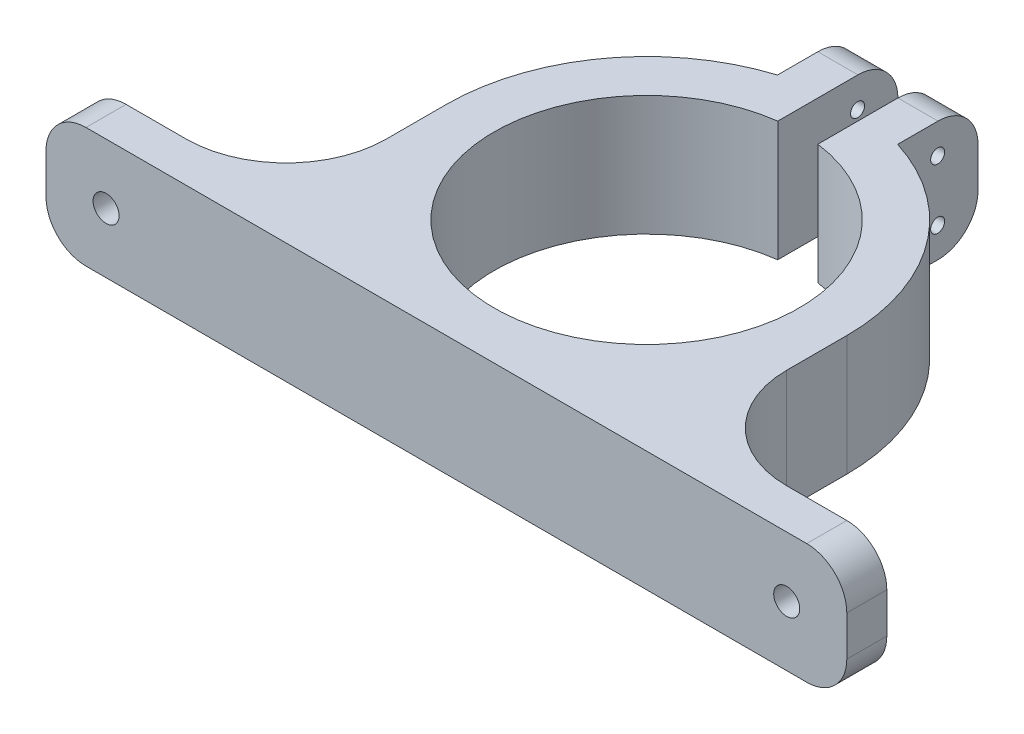
ISO-10303-21;
HEADER;
FILE_DESCRIPTION(('STEP AP214'),'2;1');
FILE_NAME('part.step','',(''),(''),'','','');
FILE_SCHEMA(('AUTOMOTIVE_DESIGN { 1 0 10303 214 1 1 1 1 }'));
ENDSEC;
DATA;
#1=APPLICATION_CONTEXT('core data for automotive mechanical design processes');
#2=APPLICATION_PROTOCOL_DEFINITION('international standard','automotive_design',2000,#1);
#3=PRODUCT_CONTEXT('',#1,'mechanical');
#4=PRODUCT('Part','Part','',(#3));
#5=PRODUCT_RELATED_PRODUCT_CATEGORY('part','',(#4));
#6=PRODUCT_DEFINITION_FORMATION('','',#4);
#7=PRODUCT_DEFINITION_CONTEXT('part definition',#1,'design');
#8=PRODUCT_DEFINITION('design','',#6,#7);
#9=PRODUCT_DEFINITION_SHAPE('','',#8);
#10=(LENGTH_UNIT() NAMED_UNIT(*) SI_UNIT(.MILLI.,.METRE.));
#11=(NAMED_UNIT(*) PLANE_ANGLE_UNIT() SI_UNIT($,.RADIAN.));
#12=(NAMED_UNIT(*) SI_UNIT($,.STERADIAN.) SOLID_ANGLE_UNIT());
#13=UNCERTAINTY_MEASURE_WITH_UNIT(LENGTH_MEASURE(1.E-05),#10,'distance_accuracy_value','');
#14=(GEOMETRIC_REPRESENTATION_CONTEXT(3) GLOBAL_UNCERTAINTY_ASSIGNED_CONTEXT((#13)) GLOBAL_UNIT_ASSIGNED_CONTEXT((#10,
#11,#12)) REPRESENTATION_CONTEXT('',''));
#15=CARTESIAN_POINT('',(0.,0.,0.));
#16=DIRECTION('',(0.,0.,1.));
#17=DIRECTION('',(1.,0.,0.));
#18=AXIS2_PLACEMENT_3D('',#15,#16,#17);
#19=CARTESIAN_POINT('',(0.,117.,-50.));
#20=DIRECTION('',(0.,1.,0.));
#21=DIRECTION('',(0.,0.,1.));
#22=AXIS2_PLACEMENT_3D('',#19,#20,#21);
#23=CYLINDRICAL_SURFACE('',#22,50.);
#24=DIRECTION('',(0.,1.,0.));
#25=VECTOR('',#24,1.);
#26=CARTESIAN_POINT('',(-15.,117.,-97.6969600708473));
#27=LINE('',#26,#25);
#28=CARTESIAN_POINT('',(-15.,117.,-97.6969600708473));
#29=VERTEX_POINT('',#28);
#30=CARTESIAN_POINT('',(-15.,147.,-97.6969600708473));
#31=VERTEX_POINT('',#30);
#32=EDGE_CURVE('E436',#29,#31,#27,.T.);
#33=ORIENTED_EDGE('',*,*,#32,.F.);
#34=CARTESIAN_POINT('',(0.,117.,-50.));
#35=DIRECTION('',(0.,1.,0.));
#36=DIRECTION('',(0.,0.,-1.));
#37=AXIS2_PLACEMENT_3D('',#34,#35,#36);
#38=CIRCLE('',#37,50.);
#39=CARTESIAN_POINT('',(-50.,117.,-50.));
#40=VERTEX_POINT('',#39);
#41=EDGE_CURVE('E259',#29,#40,#38,.T.);
#42=ORIENTED_EDGE('',*,*,#41,.T.);
#43=DIRECTION('',(0.,1.,0.));
#44=VECTOR('',#43,1.);
#45=CARTESIAN_POINT('',(-50.,117.,-50.));
#46=LINE('',#45,#44);
#47=CARTESIAN_POINT('',(-50.,147.,-50.));
#48=VERTEX_POINT('',#47);
#49=EDGE_CURVE('E263',#40,#48,#46,.T.);
#50=ORIENTED_EDGE('',*,*,#49,.T.);
#51=CARTESIAN_POINT('',(0.,147.,-50.));
#52=DIRECTION('',(0.,1.,0.));
#53=DIRECTION('',(0.,0.,-1.));
#54=AXIS2_PLACEMENT_3D('',#51,#52,#53);
#55=CIRCLE('',#54,50.);
#56=EDGE_CURVE('E246',#31,#48,#55,.T.);
#57=ORIENTED_EDGE('',*,*,#56,.F.);
#58=EDGE_LOOP('',(#33,#42,#50,#57));
#59=FACE_BOUND('',#58,.T.);
#60=ADVANCED_FACE('F43',(#59),#23,.T.);
#61=CARTESIAN_POINT('',(-50.,117.,-50.));
#62=DIRECTION('',(-1.,0.,0.));
#63=DIRECTION('',(0.,0.,1.));
#64=AXIS2_PLACEMENT_3D('',#61,#62,#63);
#65=PLANE('',#64);
#66=DIRECTION('',(0.,0.,1.));
#67=VECTOR('',#66,1.);
#68=CARTESIAN_POINT('',(-50.,117.,-50.));
#69=LINE('',#68,#67);
#70=CARTESIAN_POINT('',(-50.,117.,-35.));
#71=VERTEX_POINT('',#70);
#72=EDGE_CURVE('E409',#40,#71,#69,.T.);
#73=ORIENTED_EDGE('',*,*,#72,.T.);
#74=DIRECTION('',(0.,-1.,0.));
#75=VECTOR('',#74,1.);
#76=CARTESIAN_POINT('',(-50.,117.,-35.));
#77=LINE('',#76,#75);
#78=CARTESIAN_POINT('',(-50.,147.,-35.));
#79=VERTEX_POINT('',#78);
#80=EDGE_CURVE('E268',#71,#79,#77,.F.);
#81=ORIENTED_EDGE('',*,*,#80,.T.);
#82=DIRECTION('',(0.,0.,1.));
#83=VECTOR('',#82,1.);
#84=CARTESIAN_POINT('',(-50.,147.,-50.));
#85=LINE('',#84,#83);
#86=EDGE_CURVE('E245',#48,#79,#85,.T.);
#87=ORIENTED_EDGE('',*,*,#86,.F.);
#88=ORIENTED_EDGE('',*,*,#49,.F.);
#89=EDGE_LOOP('',(#73,#81,#87,#88));
#90=FACE_BOUND('',#89,.T.);
#91=ADVANCED_FACE('F478',(#90),#65,.T.);
#92=DIRECTION('',(0.,1.,0.));
#93=VECTOR('',#92,1.);
#94=CARTESIAN_POINT('',(15.,117.,-97.6969600708473));
#95=LINE('',#94,#93);
#96=CARTESIAN_POINT('',(15.,147.,-97.6969600708473));
#97=VERTEX_POINT('',#96);
#98=CARTESIAN_POINT('',(15.,117.,-97.6969600708473));
#99=VERTEX_POINT('',#98);
#100=EDGE_CURVE('E219',#97,#99,#95,.F.);
#101=ORIENTED_EDGE('',*,*,#100,.F.);
#102=CARTESIAN_POINT('',(50.,147.,-50.));
#103=VERTEX_POINT('',#102);
#104=EDGE_CURVE('E235',#103,#97,#55,.T.);
#105=ORIENTED_EDGE('',*,*,#104,.F.);
#106=DIRECTION('',(0.,1.,0.));
#107=VECTOR('',#106,1.);
#108=CARTESIAN_POINT('',(50.,117.,-50.));
#109=LINE('',#108,#107);
#110=CARTESIAN_POINT('',(50.,117.,-50.));
#111=VERTEX_POINT('',#110);
#112=EDGE_CURVE('E260',#111,#103,#109,.T.);
#113=ORIENTED_EDGE('',*,*,#112,.F.);
#114=EDGE_CURVE('E237',#111,#99,#38,.T.);
#115=ORIENTED_EDGE('',*,*,#114,.T.);
#116=EDGE_LOOP('',(#101,#105,#113,#115));
#117=FACE_BOUND('',#116,.T.);
#118=ADVANCED_FACE('F233',(#117),#23,.T.);
#119=CARTESIAN_POINT('',(50.,117.,-50.));
#120=DIRECTION('',(1.,0.,0.));
#121=DIRECTION('',(0.,0.,-1.));
#122=AXIS2_PLACEMENT_3D('',#119,#120,#121);
#123=PLANE('',#122);
#124=DIRECTION('',(0.,0.,-1.));
#125=VECTOR('',#124,1.);
#126=CARTESIAN_POINT('',(50.,147.,-50.));
#127=LINE('',#126,#125);
#128=CARTESIAN_POINT('',(50.,147.,-35.));
#129=VERTEX_POINT('',#128);
#130=EDGE_CURVE('E243',#129,#103,#127,.T.);
#131=ORIENTED_EDGE('',*,*,#130,.F.);
#132=DIRECTION('',(0.,1.,0.));
#133=VECTOR('',#132,1.);
#134=CARTESIAN_POINT('',(50.,117.,-35.));
#135=LINE('',#134,#133);
#136=CARTESIAN_POINT('',(50.,117.,-35.));
#137=VERTEX_POINT('',#136);
#138=EDGE_CURVE('E273',#129,#137,#135,.F.);
#139=ORIENTED_EDGE('',*,*,#138,.T.);
#140=DIRECTION('',(0.,0.,-1.));
#141=VECTOR('',#140,1.);
#142=CARTESIAN_POINT('',(50.,117.,-50.));
#143=LINE('',#142,#141);
#144=EDGE_CURVE('E253',#137,#111,#143,.T.);
#145=ORIENTED_EDGE('',*,*,#144,.T.);
#146=ORIENTED_EDGE('',*,*,#112,.T.);
#147=EDGE_LOOP('',(#131,#139,#145,#146));
#148=FACE_BOUND('',#147,.T.);
#149=ADVANCED_FACE('F415',(#148),#123,.T.);
#150=CARTESIAN_POINT('',(-50.,117.,0.));
#151=DIRECTION('',(0.,0.,1.));
#152=DIRECTION('',(1.,0.,0.));
#153=AXIS2_PLACEMENT_3D('',#150,#151,#152);
#154=PLANE('',#153);
#155=CARTESIAN_POINT('',(85.,132.,0.));
#156=DIRECTION('',(0.,0.,1.));
#157=DIRECTION('',(1.,0.,0.));
#158=AXIS2_PLACEMENT_3D('',#155,#156,#157);
#159=CIRCLE('',#158,3.25000000000001);
#160=CARTESIAN_POINT('',(88.25,132.,0.));
#161=VERTEX_POINT('',#160);
#162=EDGE_CURVE('E339',#161,#161,#159,.F.);
#163=ORIENTED_EDGE('',*,*,#162,.T.);
#164=EDGE_LOOP('',(#163));
#165=FACE_BOUND('',#164,.T.);
#166=CARTESIAN_POINT('',(-85.,132.,0.));
#167=DIRECTION('',(0.,0.,1.));
#168=DIRECTION('',(1.,0.,0.));
#169=AXIS2_PLACEMENT_3D('',#166,#167,#168);
#170=CIRCLE('',#169,3.25000000000001);
#171=CARTESIAN_POINT('',(-81.75,132.,0.));
#172=VERTEX_POINT('',#171);
#173=EDGE_CURVE('E330',#172,#172,#170,.F.);
#174=ORIENTED_EDGE('',*,*,#173,.T.);
#175=EDGE_LOOP('',(#174));
#176=FACE_BOUND('',#175,.T.);
#177=DIRECTION('',(1.,0.,0.));
#178=VECTOR('',#177,1.);
#179=CARTESIAN_POINT('',(-50.,147.,0.));
#180=LINE('',#179,#178);
#181=CARTESIAN_POINT('',(-90.,147.,0.));
#182=VERTEX_POINT('',#181);
#183=CARTESIAN_POINT('',(90.,147.,0.));
#184=VERTEX_POINT('',#183);
#185=EDGE_CURVE('E249',#182,#184,#180,.T.);
#186=ORIENTED_EDGE('',*,*,#185,.F.);
#187=CARTESIAN_POINT('',(-90.,137.,0.));
#188=DIRECTION('',(0.,0.,1.));
#189=DIRECTION('',(1.,0.,0.));
#190=AXIS2_PLACEMENT_3D('',#187,#188,#189);
#191=CIRCLE('',#190,10.);
#192=CARTESIAN_POINT('',(-100.,137.,0.));
#193=VERTEX_POINT('',#192);
#194=EDGE_CURVE('E353',#182,#193,#191,.T.);
#195=ORIENTED_EDGE('',*,*,#194,.T.);
#196=DIRECTION('',(0.,1.,0.));
#197=VECTOR('',#196,1.);
#198=CARTESIAN_POINT('',(-100.,147.,0.));
#199=LINE('',#198,#197);
#200=CARTESIAN_POINT('',(-100.,127.,0.));
#201=VERTEX_POINT('',#200);
#202=EDGE_CURVE('E382',#201,#193,#199,.T.);
#203=ORIENTED_EDGE('',*,*,#202,.F.);
#204=CARTESIAN_POINT('',(-90.,127.,0.));
#205=DIRECTION('',(0.,0.,1.));
#206=DIRECTION('',(1.,0.,0.));
#207=AXIS2_PLACEMENT_3D('',#204,#205,#206);
#208=CIRCLE('',#207,10.);
#209=CARTESIAN_POINT('',(-90.,117.,0.));
#210=VERTEX_POINT('',#209);
#211=EDGE_CURVE('E351',#201,#210,#208,.T.);
#212=ORIENTED_EDGE('',*,*,#211,.T.);
#213=DIRECTION('',(1.,0.,0.));
#214=VECTOR('',#213,1.);
#215=CARTESIAN_POINT('',(-50.,117.,0.));
#216=LINE('',#215,#214);
#217=CARTESIAN_POINT('',(90.,117.,0.));
#218=VERTEX_POINT('',#217);
#219=EDGE_CURVE('E411',#210,#218,#216,.T.);
#220=ORIENTED_EDGE('',*,*,#219,.T.);
#221=CARTESIAN_POINT('',(90.,127.,0.));
#222=DIRECTION('',(0.,0.,1.));
#223=DIRECTION('',(1.,0.,0.));
#224=AXIS2_PLACEMENT_3D('',#221,#222,#223);
#225=CIRCLE('',#224,10.);
#226=CARTESIAN_POINT('',(100.,127.,0.));
#227=VERTEX_POINT('',#226);
#228=EDGE_CURVE('E349',#218,#227,#225,.T.);
#229=ORIENTED_EDGE('',*,*,#228,.T.);
#230=DIRECTION('',(0.,-1.,0.));
#231=VECTOR('',#230,1.);
#232=CARTESIAN_POINT('',(100.,147.,0.));
#233=LINE('',#232,#231);
#234=CARTESIAN_POINT('',(100.,137.,0.));
#235=VERTEX_POINT('',#234);
#236=EDGE_CURVE('E375',#235,#227,#233,.T.);
#237=ORIENTED_EDGE('',*,*,#236,.F.);
#238=CARTESIAN_POINT('',(90.,137.,0.));
#239=DIRECTION('',(0.,0.,1.));
#240=DIRECTION('',(1.,0.,0.));
#241=AXIS2_PLACEMENT_3D('',#238,#239,#240);
#242=CIRCLE('',#241,10.);
#243=EDGE_CURVE('E347',#235,#184,#242,.T.);
#244=ORIENTED_EDGE('',*,*,#243,.T.);
#245=EDGE_LOOP('',(#186,#195,#203,#212,#220,#229,#237,#244));
#246=FACE_BOUND('',#245,.T.);
#247=ADVANCED_FACE('F380',(#165,#176,#246),#154,.T.);
#248=CARTESIAN_POINT('',(0.,117.,-50.));
#249=DIRECTION('',(0.,-1.,0.));
#250=DIRECTION('',(0.,0.,-1.));
#251=AXIS2_PLACEMENT_3D('',#248,#249,#250);
#252=PLANE('',#251);
#253=ORIENTED_EDGE('',*,*,#219,.F.);
#254=DIRECTION('',(0.,0.,1.));
#255=VECTOR('',#254,1.);
#256=CARTESIAN_POINT('',(-90.,117.,-10.));
#257=LINE('',#256,#255);
#258=CARTESIAN_POINT('',(-90.,117.,-10.));
#259=VERTEX_POINT('',#258);
#260=EDGE_CURVE('E367',#210,#259,#257,.F.);
#261=ORIENTED_EDGE('',*,*,#260,.T.);
#262=DIRECTION('',(-1.,0.,0.));
#263=VECTOR('',#262,1.);
#264=CARTESIAN_POINT('',(-100.,117.,-10.));
#265=LINE('',#264,#263);
#266=CARTESIAN_POINT('',(-75.,117.,-10.));
#267=VERTEX_POINT('',#266);
#268=EDGE_CURVE('E386',#267,#259,#265,.T.);
#269=ORIENTED_EDGE('',*,*,#268,.F.);
#270=CARTESIAN_POINT('',(-75.,117.,-35.));
#271=DIRECTION('',(0.,-1.,0.));
#272=DIRECTION('',(0.,0.,-1.));
#273=AXIS2_PLACEMENT_3D('',#270,#271,#272);
#274=CIRCLE('',#273,25.);
#275=EDGE_CURVE('E275',#267,#71,#274,.F.);
#276=ORIENTED_EDGE('',*,*,#275,.T.);
#277=ORIENTED_EDGE('',*,*,#72,.F.);
#278=ORIENTED_EDGE('',*,*,#41,.F.);
#279=DIRECTION('',(0.,0.,1.));
#280=VECTOR('',#279,1.);
#281=CARTESIAN_POINT('',(-15.,117.,-117.770491127334));
#282=LINE('',#281,#280);
#283=CARTESIAN_POINT('',(-15.,117.,-107.770491127334));
#284=VERTEX_POINT('',#283);
#285=EDGE_CURVE('E429',#284,#29,#282,.T.);
#286=ORIENTED_EDGE('',*,*,#285,.F.);
#287=DIRECTION('',(-1.,0.,0.));
#288=VECTOR('',#287,1.);
#289=CARTESIAN_POINT('',(0.,117.,-107.770491127334));
#290=LINE('',#289,#288);
#291=CARTESIAN_POINT('',(-5.,117.,-107.770491127334));
#292=VERTEX_POINT('',#291);
#293=EDGE_CURVE('E300',#284,#292,#290,.F.);
#294=ORIENTED_EDGE('',*,*,#293,.T.);
#295=DIRECTION('',(0.,0.,-1.));
#296=VECTOR('',#295,1.);
#297=CARTESIAN_POINT('',(-4.99999999999999,117.,-50.));
#298=LINE('',#297,#296);
#299=CARTESIAN_POINT('',(-5.,117.,-87.7704911273338));
#300=VERTEX_POINT('',#299);
#301=EDGE_CURVE('E391',#300,#292,#298,.T.);
#302=ORIENTED_EDGE('',*,*,#301,.F.);
#303=CARTESIAN_POINT('',(0.,117.,-50.));
#304=DIRECTION('',(0.,1.,0.));
#305=DIRECTION('',(0.,0.,1.));
#306=AXIS2_PLACEMENT_3D('',#303,#304,#305);
#307=CIRCLE('',#306,38.1);
#308=CARTESIAN_POINT('',(5.,117.,-87.7704911273338));
#309=VERTEX_POINT('',#308);
#310=EDGE_CURVE('E251',#300,#309,#307,.T.);
#311=ORIENTED_EDGE('',*,*,#310,.T.);
#312=DIRECTION('',(0.,0.,1.));
#313=VECTOR('',#312,1.);
#314=CARTESIAN_POINT('',(4.99999999999999,117.,-50.));
#315=LINE('',#314,#313);
#316=CARTESIAN_POINT('',(5.,117.,-107.770491127334));
#317=VERTEX_POINT('',#316);
#318=EDGE_CURVE('E443',#317,#309,#315,.T.);
#319=ORIENTED_EDGE('',*,*,#318,.F.);
#320=DIRECTION('',(-1.,0.,0.));
#321=VECTOR('',#320,1.);
#322=CARTESIAN_POINT('',(0.,117.,-107.770491127334));
#323=LINE('',#322,#321);
#324=CARTESIAN_POINT('',(15.,117.,-107.770491127334));
#325=VERTEX_POINT('',#324);
#326=EDGE_CURVE('E302',#317,#325,#323,.F.);
#327=ORIENTED_EDGE('',*,*,#326,.T.);
#328=DIRECTION('',(0.,0.,-1.));
#329=VECTOR('',#328,1.);
#330=CARTESIAN_POINT('',(15.,117.,-117.770491127334));
#331=LINE('',#330,#329);
#332=EDGE_CURVE('E228',#99,#325,#331,.T.);
#333=ORIENTED_EDGE('',*,*,#332,.F.);
#334=ORIENTED_EDGE('',*,*,#114,.F.);
#335=ORIENTED_EDGE('',*,*,#144,.F.);
#336=CARTESIAN_POINT('',(75.,117.,-35.));
#337=DIRECTION('',(0.,-1.,0.));
#338=DIRECTION('',(0.,0.,-1.));
#339=AXIS2_PLACEMENT_3D('',#336,#337,#338);
#340=CIRCLE('',#339,25.);
#341=CARTESIAN_POINT('',(75.,117.,-10.));
#342=VERTEX_POINT('',#341);
#343=EDGE_CURVE('E282',#137,#342,#340,.F.);
#344=ORIENTED_EDGE('',*,*,#343,.T.);
#345=DIRECTION('',(-1.,0.,0.));
#346=VECTOR('',#345,1.);
#347=CARTESIAN_POINT('',(100.,117.,-10.));
#348=LINE('',#347,#346);
#349=CARTESIAN_POINT('',(90.,117.,-10.));
#350=VERTEX_POINT('',#349);
#351=EDGE_CURVE('E393',#350,#342,#348,.T.);
#352=ORIENTED_EDGE('',*,*,#351,.F.);
#353=DIRECTION('',(0.,0.,1.));
#354=VECTOR('',#353,1.);
#355=CARTESIAN_POINT('',(90.,117.,0.));
#356=LINE('',#355,#354);
#357=EDGE_CURVE('E364',#350,#218,#356,.T.);
#358=ORIENTED_EDGE('',*,*,#357,.T.);
#359=EDGE_LOOP('',(#253,#261,#269,#276,#277,#278,#286,#294,#302,#311,#319,#327,#333,#334,#335,
#344,#352,#358));
#360=FACE_BOUND('',#359,.T.);
#361=ADVANCED_FACE('F419',(#360),#252,.T.);
#362=CARTESIAN_POINT('',(0.,147.,-50.));
#363=DIRECTION('',(0.,-1.,0.));
#364=DIRECTION('',(0.,0.,-1.));
#365=AXIS2_PLACEMENT_3D('',#362,#363,#364);
#366=PLANE('',#365);
#367=DIRECTION('',(1.,0.,0.));
#368=VECTOR('',#367,1.);
#369=CARTESIAN_POINT('',(-50.,147.,-10.));
#370=LINE('',#369,#368);
#371=CARTESIAN_POINT('',(-90.,147.,-10.));
#372=VERTEX_POINT('',#371);
#373=CARTESIAN_POINT('',(-75.,147.,-10.));
#374=VERTEX_POINT('',#373);
#375=EDGE_CURVE('E401',#372,#374,#370,.T.);
#376=ORIENTED_EDGE('',*,*,#375,.F.);
#377=DIRECTION('',(0.,0.,1.));
#378=VECTOR('',#377,1.);
#379=CARTESIAN_POINT('',(-90.,147.,-50.));
#380=LINE('',#379,#378);
#381=EDGE_CURVE('E344',#372,#182,#380,.T.);
#382=ORIENTED_EDGE('',*,*,#381,.T.);
#383=ORIENTED_EDGE('',*,*,#185,.T.);
#384=DIRECTION('',(0.,0.,1.));
#385=VECTOR('',#384,1.);
#386=CARTESIAN_POINT('',(90.,147.,-50.));
#387=LINE('',#386,#385);
#388=CARTESIAN_POINT('',(90.,147.,-10.));
#389=VERTEX_POINT('',#388);
#390=EDGE_CURVE('E325',#184,#389,#387,.F.);
#391=ORIENTED_EDGE('',*,*,#390,.T.);
#392=DIRECTION('',(1.,0.,0.));
#393=VECTOR('',#392,1.);
#394=CARTESIAN_POINT('',(50.,147.,-10.));
#395=LINE('',#394,#393);
#396=CARTESIAN_POINT('',(75.,147.,-10.));
#397=VERTEX_POINT('',#396);
#398=EDGE_CURVE('E383',#397,#389,#395,.T.);
#399=ORIENTED_EDGE('',*,*,#398,.F.);
#400=CARTESIAN_POINT('',(75.,147.,-35.));
#401=DIRECTION('',(0.,-1.,0.));
#402=DIRECTION('',(0.,0.,-1.));
#403=AXIS2_PLACEMENT_3D('',#400,#401,#402);
#404=CIRCLE('',#403,25.);
#405=EDGE_CURVE('E280',#397,#129,#404,.T.);
#406=ORIENTED_EDGE('',*,*,#405,.T.);
#407=ORIENTED_EDGE('',*,*,#130,.T.);
#408=ORIENTED_EDGE('',*,*,#104,.T.);
#409=DIRECTION('',(0.,0.,-1.));
#410=VECTOR('',#409,1.);
#411=CARTESIAN_POINT('',(15.,147.,-117.770491127334));
#412=LINE('',#411,#410);
#413=CARTESIAN_POINT('',(15.,147.,-107.770491127334));
#414=VERTEX_POINT('',#413);
#415=EDGE_CURVE('E215',#97,#414,#412,.T.);
#416=ORIENTED_EDGE('',*,*,#415,.T.);
#417=DIRECTION('',(-1.,0.,0.));
#418=VECTOR('',#417,1.);
#419=CARTESIAN_POINT('',(5.,147.,-107.770491127334));
#420=LINE('',#419,#418);
#421=CARTESIAN_POINT('',(5.,147.,-107.770491127334));
#422=VERTEX_POINT('',#421);
#423=EDGE_CURVE('E310',#414,#422,#420,.T.);
#424=ORIENTED_EDGE('',*,*,#423,.T.);
#425=DIRECTION('',(0.,0.,1.));
#426=VECTOR('',#425,1.);
#427=CARTESIAN_POINT('',(4.99999999999999,147.,-50.));
#428=LINE('',#427,#426);
#429=CARTESIAN_POINT('',(5.,147.,-87.7704911273338));
#430=VERTEX_POINT('',#429);
#431=EDGE_CURVE('E441',#422,#430,#428,.T.);
#432=ORIENTED_EDGE('',*,*,#431,.T.);
#433=CARTESIAN_POINT('',(0.,147.,-50.));
#434=DIRECTION('',(0.,1.,0.));
#435=DIRECTION('',(0.,0.,1.));
#436=AXIS2_PLACEMENT_3D('',#433,#434,#435);
#437=CIRCLE('',#436,38.1);
#438=CARTESIAN_POINT('',(-5.,147.,-87.7704911273338));
#439=VERTEX_POINT('',#438);
#440=EDGE_CURVE('E402',#439,#430,#437,.T.);
#441=ORIENTED_EDGE('',*,*,#440,.F.);
#442=DIRECTION('',(0.,0.,-1.));
#443=VECTOR('',#442,1.);
#444=CARTESIAN_POINT('',(-4.99999999999999,147.,-50.));
#445=LINE('',#444,#443);
#446=CARTESIAN_POINT('',(-5.,147.,-107.770491127334));
#447=VERTEX_POINT('',#446);
#448=EDGE_CURVE('E444',#439,#447,#445,.T.);
#449=ORIENTED_EDGE('',*,*,#448,.T.);
#450=DIRECTION('',(-1.,0.,0.));
#451=VECTOR('',#450,1.);
#452=CARTESIAN_POINT('',(-15.,147.,-107.770491127334));
#453=LINE('',#452,#451);
#454=CARTESIAN_POINT('',(-15.,147.,-107.770491127334));
#455=VERTEX_POINT('',#454);
#456=EDGE_CURVE('E307',#447,#455,#453,.T.);
#457=ORIENTED_EDGE('',*,*,#456,.T.);
#458=DIRECTION('',(0.,0.,1.));
#459=VECTOR('',#458,1.);
#460=CARTESIAN_POINT('',(-15.,147.,-117.770491127334));
#461=LINE('',#460,#459);
#462=EDGE_CURVE('E238',#455,#31,#461,.T.);
#463=ORIENTED_EDGE('',*,*,#462,.T.);
#464=ORIENTED_EDGE('',*,*,#56,.T.);
#465=ORIENTED_EDGE('',*,*,#86,.T.);
#466=CARTESIAN_POINT('',(-75.,147.,-35.));
#467=DIRECTION('',(0.,-1.,0.));
#468=DIRECTION('',(0.,0.,-1.));
#469=AXIS2_PLACEMENT_3D('',#466,#467,#468);
#470=CIRCLE('',#469,25.);
#471=EDGE_CURVE('E277',#79,#374,#470,.T.);
#472=ORIENTED_EDGE('',*,*,#471,.T.);
#473=EDGE_LOOP('',(#376,#382,#383,#391,#399,#406,#407,#408,#416,#424,#432,#441,#449,#457,#463,
#464,#465,#472));
#474=FACE_BOUND('',#473,.T.);
#475=ADVANCED_FACE('F241',(#474),#366,.F.);
#476=CARTESIAN_POINT('',(0.,117.,-50.));
#477=DIRECTION('',(0.,1.,0.));
#478=DIRECTION('',(0.,0.,1.));
#479=AXIS2_PLACEMENT_3D('',#476,#477,#478);
#480=CYLINDRICAL_SURFACE('',#479,38.1);
#481=ORIENTED_EDGE('',*,*,#310,.F.);
#482=DIRECTION('',(0.,1.,0.));
#483=VECTOR('',#482,1.);
#484=CARTESIAN_POINT('',(-5.,117.,-87.7704911273338));
#485=LINE('',#484,#483);
#486=EDGE_CURVE('E288',#300,#439,#485,.T.);
#487=ORIENTED_EDGE('',*,*,#486,.T.);
#488=ORIENTED_EDGE('',*,*,#440,.T.);
#489=DIRECTION('',(0.,1.,0.));
#490=VECTOR('',#489,1.);
#491=CARTESIAN_POINT('',(5.,117.,-87.7704911273338));
#492=LINE('',#491,#490);
#493=EDGE_CURVE('E285',#430,#309,#492,.F.);
#494=ORIENTED_EDGE('',*,*,#493,.T.);
#495=EDGE_LOOP('',(#481,#487,#488,#494));
#496=FACE_BOUND('',#495,.T.);
#497=ADVANCED_FACE('F534',(#496),#480,.F.);
#498=CARTESIAN_POINT('',(-100.,147.,-10.));
#499=DIRECTION('',(1.,0.,0.));
#500=DIRECTION('',(0.,0.,-1.));
#501=AXIS2_PLACEMENT_3D('',#498,#499,#500);
#502=PLANE('',#501);
#503=ORIENTED_EDGE('',*,*,#202,.T.);
#504=DIRECTION('',(0.,0.,1.));
#505=VECTOR('',#504,1.);
#506=CARTESIAN_POINT('',(-100.,137.,-10.));
#507=LINE('',#506,#505);
#508=CARTESIAN_POINT('',(-100.,137.,-10.));
#509=VERTEX_POINT('',#508);
#510=EDGE_CURVE('E358',#193,#509,#507,.F.);
#511=ORIENTED_EDGE('',*,*,#510,.T.);
#512=DIRECTION('',(0.,1.,0.));
#513=VECTOR('',#512,1.);
#514=CARTESIAN_POINT('',(-100.,147.,-10.));
#515=LINE('',#514,#513);
#516=CARTESIAN_POINT('',(-100.,127.,-10.));
#517=VERTEX_POINT('',#516);
#518=EDGE_CURVE('E398',#517,#509,#515,.T.);
#519=ORIENTED_EDGE('',*,*,#518,.F.);
#520=DIRECTION('',(0.,0.,1.));
#521=VECTOR('',#520,1.);
#522=CARTESIAN_POINT('',(-100.,127.,0.));
#523=LINE('',#522,#521);
#524=EDGE_CURVE('E355',#517,#201,#523,.T.);
#525=ORIENTED_EDGE('',*,*,#524,.T.);
#526=EDGE_LOOP('',(#503,#511,#519,#525));
#527=FACE_BOUND('',#526,.T.);
#528=ADVANCED_FACE('F495',(#527),#502,.F.);
#529=CARTESIAN_POINT('',(0.,0.,-10.));
#530=DIRECTION('',(0.,0.,1.));
#531=DIRECTION('',(1.,0.,0.));
#532=AXIS2_PLACEMENT_3D('',#529,#530,#531);
#533=PLANE('',#532);
#534=CARTESIAN_POINT('',(-85.,132.,-9.99999999999999));
#535=DIRECTION('',(0.,0.,1.));
#536=DIRECTION('',(1.,0.,0.));
#537=AXIS2_PLACEMENT_3D('',#534,#535,#536);
#538=CIRCLE('',#537,3.25000000000001);
#539=CARTESIAN_POINT('',(-81.75,132.,-9.99999999999999));
#540=VERTEX_POINT('',#539);
#541=EDGE_CURVE('E340',#540,#540,#538,.F.);
#542=ORIENTED_EDGE('',*,*,#541,.F.);
#543=EDGE_LOOP('',(#542));
#544=FACE_BOUND('',#543,.T.);
#545=ORIENTED_EDGE('',*,*,#518,.T.);
#546=CARTESIAN_POINT('',(-90.,137.,-10.));
#547=DIRECTION('',(0.,0.,1.));
#548=DIRECTION('',(1.,0.,0.));
#549=AXIS2_PLACEMENT_3D('',#546,#547,#548);
#550=CIRCLE('',#549,10.);
#551=EDGE_CURVE('E362',#509,#372,#550,.F.);
#552=ORIENTED_EDGE('',*,*,#551,.T.);
#553=ORIENTED_EDGE('',*,*,#375,.T.);
#554=DIRECTION('',(0.,-1.,0.));
#555=VECTOR('',#554,1.);
#556=CARTESIAN_POINT('',(-75.,0.,-10.));
#557=LINE('',#556,#555);
#558=EDGE_CURVE('E262',#374,#267,#557,.T.);
#559=ORIENTED_EDGE('',*,*,#558,.T.);
#560=ORIENTED_EDGE('',*,*,#268,.T.);
#561=CARTESIAN_POINT('',(-90.,127.,-10.));
#562=DIRECTION('',(0.,0.,1.));
#563=DIRECTION('',(1.,0.,0.));
#564=AXIS2_PLACEMENT_3D('',#561,#562,#563);
#565=CIRCLE('',#564,10.);
#566=EDGE_CURVE('E360',#259,#517,#565,.F.);
#567=ORIENTED_EDGE('',*,*,#566,.T.);
#568=EDGE_LOOP('',(#545,#552,#553,#559,#560,#567));
#569=FACE_BOUND('',#568,.T.);
#570=ADVANCED_FACE('F486',(#544,#569),#533,.F.);
#571=CARTESIAN_POINT('',(100.,147.,-10.));
#572=DIRECTION('',(-1.,0.,0.));
#573=DIRECTION('',(0.,0.,1.));
#574=AXIS2_PLACEMENT_3D('',#571,#572,#573);
#575=PLANE('',#574);
#576=ORIENTED_EDGE('',*,*,#236,.T.);
#577=DIRECTION('',(0.,0.,1.));
#578=VECTOR('',#577,1.);
#579=CARTESIAN_POINT('',(100.,127.,-10.));
#580=LINE('',#579,#578);
#581=CARTESIAN_POINT('',(100.,127.,-10.));
#582=VERTEX_POINT('',#581);
#583=EDGE_CURVE('E58',#227,#582,#580,.F.);
#584=ORIENTED_EDGE('',*,*,#583,.T.);
#585=DIRECTION('',(0.,-1.,0.));
#586=VECTOR('',#585,1.);
#587=CARTESIAN_POINT('',(100.,147.,-10.));
#588=LINE('',#587,#586);
#589=CARTESIAN_POINT('',(100.,137.,-10.));
#590=VERTEX_POINT('',#589);
#591=EDGE_CURVE('E376',#590,#582,#588,.T.);
#592=ORIENTED_EDGE('',*,*,#591,.F.);
#593=DIRECTION('',(0.,0.,1.));
#594=VECTOR('',#593,1.);
#595=CARTESIAN_POINT('',(100.,137.,-10.));
#596=LINE('',#595,#594);
#597=EDGE_CURVE('E369',#590,#235,#596,.T.);
#598=ORIENTED_EDGE('',*,*,#597,.T.);
#599=EDGE_LOOP('',(#576,#584,#592,#598));
#600=FACE_BOUND('',#599,.T.);
#601=ADVANCED_FACE('F374',(#600),#575,.F.);
#602=CARTESIAN_POINT('',(0.,0.,-10.));
#603=DIRECTION('',(0.,0.,-1.));
#604=DIRECTION('',(-1.,0.,0.));
#605=AXIS2_PLACEMENT_3D('',#602,#603,#604);
#606=PLANE('',#605);
#607=CARTESIAN_POINT('',(85.,132.,-9.99999999999999));
#608=DIRECTION('',(0.,0.,-1.));
#609=DIRECTION('',(-1.,0.,0.));
#610=AXIS2_PLACEMENT_3D('',#607,#608,#609);
#611=CIRCLE('',#610,3.25000000000001);
#612=CARTESIAN_POINT('',(81.75,132.,-9.99999999999999));
#613=VERTEX_POINT('',#612);
#614=EDGE_CURVE('E336',#613,#613,#611,.F.);
#615=ORIENTED_EDGE('',*,*,#614,.T.);
#616=EDGE_LOOP('',(#615));
#617=FACE_BOUND('',#616,.T.);
#618=ORIENTED_EDGE('',*,*,#591,.T.);
#619=CARTESIAN_POINT('',(90.,127.,-10.));
#620=DIRECTION('',(0.,0.,-1.));
#621=DIRECTION('',(-1.,0.,0.));
#622=AXIS2_PLACEMENT_3D('',#619,#620,#621);
#623=CIRCLE('',#622,10.);
#624=EDGE_CURVE('E11',#582,#350,#623,.T.);
#625=ORIENTED_EDGE('',*,*,#624,.T.);
#626=ORIENTED_EDGE('',*,*,#351,.T.);
#627=DIRECTION('',(0.,1.,0.));
#628=VECTOR('',#627,1.);
#629=CARTESIAN_POINT('',(75.,147.,-10.));
#630=LINE('',#629,#628);
#631=EDGE_CURVE('E270',#342,#397,#630,.T.);
#632=ORIENTED_EDGE('',*,*,#631,.T.);
#633=ORIENTED_EDGE('',*,*,#398,.T.);
#634=CARTESIAN_POINT('',(90.,137.,-10.));
#635=DIRECTION('',(0.,0.,-1.));
#636=DIRECTION('',(-1.,0.,0.));
#637=AXIS2_PLACEMENT_3D('',#634,#635,#636);
#638=CIRCLE('',#637,10.);
#639=EDGE_CURVE('E51',#389,#590,#638,.T.);
#640=ORIENTED_EDGE('',*,*,#639,.T.);
#641=EDGE_LOOP('',(#618,#625,#626,#632,#633,#640));
#642=FACE_BOUND('',#641,.T.);
#643=ADVANCED_FACE('F545',(#617,#642),#606,.T.);
#644=CARTESIAN_POINT('',(-75.,0.,-35.));
#645=DIRECTION('',(0.,-1.,0.));
#646=DIRECTION('',(0.,0.,-1.));
#647=AXIS2_PLACEMENT_3D('',#644,#645,#646);
#648=CYLINDRICAL_SURFACE('',#647,25.);
#649=ORIENTED_EDGE('',*,*,#471,.F.);
#650=ORIENTED_EDGE('',*,*,#80,.F.);
#651=ORIENTED_EDGE('',*,*,#275,.F.);
#652=ORIENTED_EDGE('',*,*,#558,.F.);
#653=EDGE_LOOP('',(#649,#650,#651,#652));
#654=FACE_BOUND('',#653,.T.);
#655=ADVANCED_FACE('F483',(#654),#648,.F.);
#656=CARTESIAN_POINT('',(75.,0.,-35.));
#657=DIRECTION('',(0.,-1.,0.));
#658=DIRECTION('',(0.,0.,-1.));
#659=AXIS2_PLACEMENT_3D('',#656,#657,#658);
#660=CYLINDRICAL_SURFACE('',#659,25.);
#661=ORIENTED_EDGE('',*,*,#343,.F.);
#662=ORIENTED_EDGE('',*,*,#138,.F.);
#663=ORIENTED_EDGE('',*,*,#405,.F.);
#664=ORIENTED_EDGE('',*,*,#631,.F.);
#665=EDGE_LOOP('',(#661,#662,#663,#664));
#666=FACE_BOUND('',#665,.T.);
#667=ADVANCED_FACE('F557',(#666),#660,.F.);
#668=CARTESIAN_POINT('',(5.,-150.,-105.));
#669=DIRECTION('',(1.,0.,0.));
#670=DIRECTION('',(0.,0.,-1.));
#671=AXIS2_PLACEMENT_3D('',#668,#669,#670);
#672=PLANE('',#671);
#673=CARTESIAN_POINT('',(5.,139.5,-107.696960070847));
#674=DIRECTION('',(1.,0.,0.));
#675=DIRECTION('',(0.,0.,-1.));
#676=AXIS2_PLACEMENT_3D('',#673,#674,#675);
#677=CIRCLE('',#676,1.75);
#678=CARTESIAN_POINT('',(5.,139.5,-109.446960070847));
#679=VERTEX_POINT('',#678);
#680=EDGE_CURVE('E836',#679,#679,#677,.T.);
#681=ORIENTED_EDGE('',*,*,#680,.T.);
#682=EDGE_LOOP('',(#681));
#683=FACE_BOUND('',#682,.T.);
#684=CARTESIAN_POINT('',(5.,124.5,-107.696960070847));
#685=DIRECTION('',(1.,0.,0.));
#686=DIRECTION('',(0.,0.,-1.));
#687=AXIS2_PLACEMENT_3D('',#684,#685,#686);
#688=CIRCLE('',#687,1.75);
#689=CARTESIAN_POINT('',(5.,124.5,-109.446960070847));
#690=VERTEX_POINT('',#689);
#691=EDGE_CURVE('E335',#690,#690,#688,.T.);
#692=ORIENTED_EDGE('',*,*,#691,.T.);
#693=EDGE_LOOP('',(#692));
#694=FACE_BOUND('',#693,.T.);
#695=DIRECTION('',(0.,1.,0.));
#696=VECTOR('',#695,1.);
#697=CARTESIAN_POINT('',(5.,117.,-117.770491127334));
#698=LINE('',#697,#696);
#699=CARTESIAN_POINT('',(5.,127.,-117.770491127334));
#700=VERTEX_POINT('',#699);
#701=CARTESIAN_POINT('',(5.,137.,-117.770491127334));
#702=VERTEX_POINT('',#701);
#703=EDGE_CURVE('E425',#700,#702,#698,.T.);
#704=ORIENTED_EDGE('',*,*,#703,.F.);
#705=CARTESIAN_POINT('',(5.,127.,-107.770491127334));
#706=DIRECTION('',(1.,0.,0.));
#707=DIRECTION('',(0.,0.,-1.));
#708=AXIS2_PLACEMENT_3D('',#705,#706,#707);
#709=CIRCLE('',#708,10.);
#710=EDGE_CURVE('E298',#700,#317,#709,.F.);
#711=ORIENTED_EDGE('',*,*,#710,.T.);
#712=ORIENTED_EDGE('',*,*,#318,.T.);
#713=ORIENTED_EDGE('',*,*,#493,.F.);
#714=ORIENTED_EDGE('',*,*,#431,.F.);
#715=CARTESIAN_POINT('',(5.,137.,-107.770491127334));
#716=DIRECTION('',(1.,0.,0.));
#717=DIRECTION('',(0.,0.,-1.));
#718=AXIS2_PLACEMENT_3D('',#715,#716,#717);
#719=CIRCLE('',#718,10.);
#720=EDGE_CURVE('E296',#422,#702,#719,.F.);
#721=ORIENTED_EDGE('',*,*,#720,.T.);
#722=EDGE_LOOP('',(#704,#711,#712,#713,#714,#721));
#723=FACE_BOUND('',#722,.T.);
#724=ADVANCED_FACE('F553',(#683,#694,#723),#672,.F.);
#725=CARTESIAN_POINT('',(-5.,-150.,-105.));
#726=DIRECTION('',(-1.,0.,0.));
#727=DIRECTION('',(0.,0.,1.));
#728=AXIS2_PLACEMENT_3D('',#725,#726,#727);
#729=PLANE('',#728);
#730=CARTESIAN_POINT('',(-5.,139.5,-107.696960070847));
#731=DIRECTION('',(-1.,0.,0.));
#732=DIRECTION('',(0.,0.,1.));
#733=AXIS2_PLACEMENT_3D('',#730,#731,#732);
#734=CIRCLE('',#733,1.75);
#735=CARTESIAN_POINT('',(-5.,139.5,-105.946960070847));
#736=VERTEX_POINT('',#735);
#737=EDGE_CURVE('E833',#736,#736,#734,.T.);
#738=ORIENTED_EDGE('',*,*,#737,.T.);
#739=EDGE_LOOP('',(#738));
#740=FACE_BOUND('',#739,.T.);
#741=CARTESIAN_POINT('',(-5.,124.5,-107.696960070847));
#742=DIRECTION('',(-1.,0.,0.));
#743=DIRECTION('',(0.,0.,1.));
#744=AXIS2_PLACEMENT_3D('',#741,#742,#743);
#745=CIRCLE('',#744,1.75);
#746=CARTESIAN_POINT('',(-5.,124.5,-105.946960070847));
#747=VERTEX_POINT('',#746);
#748=EDGE_CURVE('E823',#747,#747,#745,.T.);
#749=ORIENTED_EDGE('',*,*,#748,.T.);
#750=EDGE_LOOP('',(#749));
#751=FACE_BOUND('',#750,.T.);
#752=DIRECTION('',(0.,1.,0.));
#753=VECTOR('',#752,1.);
#754=CARTESIAN_POINT('',(-5.,117.,-117.770491127334));
#755=LINE('',#754,#753);
#756=CARTESIAN_POINT('',(-5.,127.,-117.770491127334));
#757=VERTEX_POINT('',#756);
#758=CARTESIAN_POINT('',(-5.,137.,-117.770491127334));
#759=VERTEX_POINT('',#758);
#760=EDGE_CURVE('E431',#757,#759,#755,.T.);
#761=ORIENTED_EDGE('',*,*,#760,.T.);
#762=CARTESIAN_POINT('',(-5.,137.,-107.770491127334));
#763=DIRECTION('',(-1.,0.,0.));
#764=DIRECTION('',(0.,0.,1.));
#765=AXIS2_PLACEMENT_3D('',#762,#763,#764);
#766=CIRCLE('',#765,10.);
#767=EDGE_CURVE('E323',#759,#447,#766,.F.);
#768=ORIENTED_EDGE('',*,*,#767,.T.);
#769=ORIENTED_EDGE('',*,*,#448,.F.);
#770=ORIENTED_EDGE('',*,*,#486,.F.);
#771=ORIENTED_EDGE('',*,*,#301,.T.);
#772=CARTESIAN_POINT('',(-5.,127.,-107.770491127334));
#773=DIRECTION('',(-1.,0.,0.));
#774=DIRECTION('',(0.,0.,1.));
#775=AXIS2_PLACEMENT_3D('',#772,#773,#774);
#776=CIRCLE('',#775,10.);
#777=EDGE_CURVE('E321',#292,#757,#776,.F.);
#778=ORIENTED_EDGE('',*,*,#777,.T.);
#779=EDGE_LOOP('',(#761,#768,#769,#770,#771,#778));
#780=FACE_BOUND('',#779,.T.);
#781=ADVANCED_FACE('F452',(#740,#751,#780),#729,.F.);
#782=CARTESIAN_POINT('',(-15.,117.,-117.770491127334));
#783=DIRECTION('',(-1.,0.,0.));
#784=DIRECTION('',(0.,0.,1.));
#785=AXIS2_PLACEMENT_3D('',#782,#783,#784);
#786=PLANE('',#785);
#787=CARTESIAN_POINT('',(-15.,139.5,-107.696960070847));
#788=DIRECTION('',(-1.,0.,0.));
#789=DIRECTION('',(0.,0.,1.));
#790=AXIS2_PLACEMENT_3D('',#787,#788,#789);
#791=CIRCLE('',#790,1.75);
#792=CARTESIAN_POINT('',(-15.,139.5,-105.946960070847));
#793=VERTEX_POINT('',#792);
#794=EDGE_CURVE('E334',#793,#793,#791,.T.);
#795=ORIENTED_EDGE('',*,*,#794,.F.);
#796=EDGE_LOOP('',(#795));
#797=FACE_BOUND('',#796,.T.);
#798=CARTESIAN_POINT('',(-15.,124.5,-107.696960070847));
#799=DIRECTION('',(-1.,0.,0.));
#800=DIRECTION('',(0.,0.,1.));
#801=AXIS2_PLACEMENT_3D('',#798,#799,#800);
#802=CIRCLE('',#801,1.75);
#803=CARTESIAN_POINT('',(-15.,124.5,-105.946960070847));
#804=VERTEX_POINT('',#803);
#805=EDGE_CURVE('E329',#804,#804,#802,.T.);
#806=ORIENTED_EDGE('',*,*,#805,.F.);
#807=EDGE_LOOP('',(#806));
#808=FACE_BOUND('',#807,.T.);
#809=ORIENTED_EDGE('',*,*,#462,.F.);
#810=CARTESIAN_POINT('',(-15.,137.,-107.770491127334));
#811=DIRECTION('',(-1.,0.,0.));
#812=DIRECTION('',(0.,0.,1.));
#813=AXIS2_PLACEMENT_3D('',#810,#811,#812);
#814=CIRCLE('',#813,10.);
#815=CARTESIAN_POINT('',(-15.,137.,-117.770491127334));
#816=VERTEX_POINT('',#815);
#817=EDGE_CURVE('E314',#455,#816,#814,.T.);
#818=ORIENTED_EDGE('',*,*,#817,.T.);
#819=DIRECTION('',(0.,1.,0.));
#820=VECTOR('',#819,1.);
#821=CARTESIAN_POINT('',(-15.,117.,-117.770491127334));
#822=LINE('',#821,#820);
#823=CARTESIAN_POINT('',(-15.,127.,-117.770491127334));
#824=VERTEX_POINT('',#823);
#825=EDGE_CURVE('E433',#824,#816,#822,.T.);
#826=ORIENTED_EDGE('',*,*,#825,.F.);
#827=CARTESIAN_POINT('',(-15.,127.,-107.770491127334));
#828=DIRECTION('',(-1.,0.,0.));
#829=DIRECTION('',(0.,0.,1.));
#830=AXIS2_PLACEMENT_3D('',#827,#828,#829);
#831=CIRCLE('',#830,10.);
#832=EDGE_CURVE('E312',#824,#284,#831,.T.);
#833=ORIENTED_EDGE('',*,*,#832,.T.);
#834=ORIENTED_EDGE('',*,*,#285,.T.);
#835=ORIENTED_EDGE('',*,*,#32,.T.);
#836=EDGE_LOOP('',(#809,#818,#826,#833,#834,#835));
#837=FACE_BOUND('',#836,.T.);
#838=ADVANCED_FACE('F465',(#797,#808,#837),#786,.T.);
#839=CARTESIAN_POINT('',(-5.,117.,-117.770491127334));
#840=DIRECTION('',(0.,0.,-1.));
#841=DIRECTION('',(-1.,0.,0.));
#842=AXIS2_PLACEMENT_3D('',#839,#840,#841);
#843=PLANE('',#842);
#844=ORIENTED_EDGE('',*,*,#825,.T.);
#845=DIRECTION('',(-1.,0.,0.));
#846=VECTOR('',#845,1.);
#847=CARTESIAN_POINT('',(-5.,137.,-117.770491127334));
#848=LINE('',#847,#846);
#849=EDGE_CURVE('E319',#816,#759,#848,.F.);
#850=ORIENTED_EDGE('',*,*,#849,.T.);
#851=ORIENTED_EDGE('',*,*,#760,.F.);
#852=DIRECTION('',(-1.,0.,0.));
#853=VECTOR('',#852,1.);
#854=CARTESIAN_POINT('',(-5.,127.,-117.770491127334));
#855=LINE('',#854,#853);
#856=EDGE_CURVE('E316',#757,#824,#855,.T.);
#857=ORIENTED_EDGE('',*,*,#856,.T.);
#858=EDGE_LOOP('',(#844,#850,#851,#857));
#859=FACE_BOUND('',#858,.T.);
#860=ADVANCED_FACE('F461',(#859),#843,.T.);
#861=CARTESIAN_POINT('',(15.,117.,-117.770491127334));
#862=DIRECTION('',(1.,0.,0.));
#863=DIRECTION('',(0.,0.,-1.));
#864=AXIS2_PLACEMENT_3D('',#861,#862,#863);
#865=PLANE('',#864);
#866=CARTESIAN_POINT('',(15.,139.5,-107.696960070847));
#867=DIRECTION('',(1.,0.,0.));
#868=DIRECTION('',(0.,0.,-1.));
#869=AXIS2_PLACEMENT_3D('',#866,#867,#868);
#870=CIRCLE('',#869,1.75);
#871=CARTESIAN_POINT('',(15.,139.5,-109.446960070847));
#872=VERTEX_POINT('',#871);
#873=EDGE_CURVE('E331',#872,#872,#870,.T.);
#874=ORIENTED_EDGE('',*,*,#873,.F.);
#875=EDGE_LOOP('',(#874));
#876=FACE_BOUND('',#875,.T.);
#877=CARTESIAN_POINT('',(15.,124.5,-107.696960070847));
#878=DIRECTION('',(1.,0.,0.));
#879=DIRECTION('',(0.,0.,-1.));
#880=AXIS2_PLACEMENT_3D('',#877,#878,#879);
#881=CIRCLE('',#880,1.75);
#882=CARTESIAN_POINT('',(15.,124.5,-109.446960070847));
#883=VERTEX_POINT('',#882);
#884=EDGE_CURVE('E326',#883,#883,#881,.T.);
#885=ORIENTED_EDGE('',*,*,#884,.F.);
#886=EDGE_LOOP('',(#885));
#887=FACE_BOUND('',#886,.T.);
#888=ORIENTED_EDGE('',*,*,#332,.T.);
#889=CARTESIAN_POINT('',(15.,127.,-107.770491127334));
#890=DIRECTION('',(1.,0.,0.));
#891=DIRECTION('',(0.,0.,-1.));
#892=AXIS2_PLACEMENT_3D('',#889,#890,#891);
#893=CIRCLE('',#892,10.);
#894=CARTESIAN_POINT('',(15.,127.,-117.770491127334));
#895=VERTEX_POINT('',#894);
#896=EDGE_CURVE('E305',#325,#895,#893,.T.);
#897=ORIENTED_EDGE('',*,*,#896,.T.);
#898=DIRECTION('',(0.,1.,0.));
#899=VECTOR('',#898,1.);
#900=CARTESIAN_POINT('',(15.,117.,-117.770491127334));
#901=LINE('',#900,#899);
#902=CARTESIAN_POINT('',(15.,137.,-117.770491127334));
#903=VERTEX_POINT('',#902);
#904=EDGE_CURVE('E423',#895,#903,#901,.T.);
#905=ORIENTED_EDGE('',*,*,#904,.T.);
#906=CARTESIAN_POINT('',(15.,137.,-107.770491127334));
#907=DIRECTION('',(1.,0.,0.));
#908=DIRECTION('',(0.,0.,-1.));
#909=AXIS2_PLACEMENT_3D('',#906,#907,#908);
#910=CIRCLE('',#909,10.);
#911=EDGE_CURVE('E223',#903,#414,#910,.T.);
#912=ORIENTED_EDGE('',*,*,#911,.T.);
#913=ORIENTED_EDGE('',*,*,#415,.F.);
#914=ORIENTED_EDGE('',*,*,#100,.T.);
#915=EDGE_LOOP('',(#888,#897,#905,#912,#913,#914));
#916=FACE_BOUND('',#915,.T.);
#917=ADVANCED_FACE('F218',(#876,#887,#916),#865,.T.);
#918=CARTESIAN_POINT('',(5.,117.,-117.770491127334));
#919=DIRECTION('',(0.,0.,-1.));
#920=DIRECTION('',(-1.,0.,0.));
#921=AXIS2_PLACEMENT_3D('',#918,#919,#920);
#922=PLANE('',#921);
#923=ORIENTED_EDGE('',*,*,#904,.F.);
#924=DIRECTION('',(-1.,0.,0.));
#925=VECTOR('',#924,1.);
#926=CARTESIAN_POINT('',(5.,127.,-117.770491127334));
#927=LINE('',#926,#925);
#928=EDGE_CURVE('E293',#895,#700,#927,.T.);
#929=ORIENTED_EDGE('',*,*,#928,.T.);
#930=ORIENTED_EDGE('',*,*,#703,.T.);
#931=DIRECTION('',(-1.,0.,0.));
#932=VECTOR('',#931,1.);
#933=CARTESIAN_POINT('',(15.,137.,-117.770491127334));
#934=LINE('',#933,#932);
#935=EDGE_CURVE('E291',#702,#903,#934,.F.);
#936=ORIENTED_EDGE('',*,*,#935,.T.);
#937=EDGE_LOOP('',(#923,#929,#930,#936));
#938=FACE_BOUND('',#937,.T.);
#939=ADVANCED_FACE('F564',(#938),#922,.T.);
#940=CARTESIAN_POINT('',(5.,127.,-107.770491127334));
#941=DIRECTION('',(-1.,0.,0.));
#942=DIRECTION('',(0.,0.,1.));
#943=AXIS2_PLACEMENT_3D('',#940,#941,#942);
#944=CYLINDRICAL_SURFACE('',#943,10.);
#945=ORIENTED_EDGE('',*,*,#896,.F.);
#946=ORIENTED_EDGE('',*,*,#326,.F.);
#947=ORIENTED_EDGE('',*,*,#710,.F.);
#948=ORIENTED_EDGE('',*,*,#928,.F.);
#949=EDGE_LOOP('',(#945,#946,#947,#948));
#950=FACE_BOUND('',#949,.T.);
#951=ADVANCED_FACE('F567',(#950),#944,.T.);
#952=CARTESIAN_POINT('',(0.,137.,-107.770491127334));
#953=DIRECTION('',(1.,0.,0.));
#954=DIRECTION('',(0.,0.,-1.));
#955=AXIS2_PLACEMENT_3D('',#952,#953,#954);
#956=CYLINDRICAL_SURFACE('',#955,10.);
#957=ORIENTED_EDGE('',*,*,#911,.F.);
#958=ORIENTED_EDGE('',*,*,#935,.F.);
#959=ORIENTED_EDGE('',*,*,#720,.F.);
#960=ORIENTED_EDGE('',*,*,#423,.F.);
#961=EDGE_LOOP('',(#957,#958,#959,#960));
#962=FACE_BOUND('',#961,.T.);
#963=ADVANCED_FACE('F613',(#962),#956,.T.);
#964=CARTESIAN_POINT('',(0.,137.,-107.770491127334));
#965=DIRECTION('',(1.,0.,0.));
#966=DIRECTION('',(0.,0.,-1.));
#967=AXIS2_PLACEMENT_3D('',#964,#965,#966);
#968=CYLINDRICAL_SURFACE('',#967,10.);
#969=ORIENTED_EDGE('',*,*,#767,.F.);
#970=ORIENTED_EDGE('',*,*,#849,.F.);
#971=ORIENTED_EDGE('',*,*,#817,.F.);
#972=ORIENTED_EDGE('',*,*,#456,.F.);
#973=EDGE_LOOP('',(#969,#970,#971,#972));
#974=FACE_BOUND('',#973,.T.);
#975=ADVANCED_FACE('F469',(#974),#968,.T.);
#976=CARTESIAN_POINT('',(-5.,127.,-107.770491127334));
#977=DIRECTION('',(-1.,0.,0.));
#978=DIRECTION('',(0.,0.,1.));
#979=AXIS2_PLACEMENT_3D('',#976,#977,#978);
#980=CYLINDRICAL_SURFACE('',#979,10.);
#981=ORIENTED_EDGE('',*,*,#777,.F.);
#982=ORIENTED_EDGE('',*,*,#293,.F.);
#983=ORIENTED_EDGE('',*,*,#832,.F.);
#984=ORIENTED_EDGE('',*,*,#856,.F.);
#985=EDGE_LOOP('',(#981,#982,#983,#984));
#986=FACE_BOUND('',#985,.T.);
#987=ADVANCED_FACE('F458',(#986),#980,.T.);
#988=CARTESIAN_POINT('',(-125.,124.5,-107.696960070847));
#989=DIRECTION('',(1.,0.,0.));
#990=DIRECTION('',(0.,0.,-1.));
#991=AXIS2_PLACEMENT_3D('',#988,#989,#990);
#992=CYLINDRICAL_SURFACE('',#991,1.75);
#993=ORIENTED_EDGE('',*,*,#884,.T.);
#994=EDGE_LOOP('',(#993));
#995=FACE_BOUND('',#994,.T.);
#996=ORIENTED_EDGE('',*,*,#691,.F.);
#997=EDGE_LOOP('',(#996));
#998=FACE_BOUND('',#997,.T.);
#999=ADVANCED_FACE('F572',(#995,#998),#992,.F.);
#1000=CARTESIAN_POINT('',(-125.,139.5,-107.696960070847));
#1001=DIRECTION('',(1.,0.,0.));
#1002=DIRECTION('',(0.,0.,-1.));
#1003=AXIS2_PLACEMENT_3D('',#1000,#1001,#1002);
#1004=CYLINDRICAL_SURFACE('',#1003,1.75);
#1005=ORIENTED_EDGE('',*,*,#873,.T.);
#1006=EDGE_LOOP('',(#1005));
#1007=FACE_BOUND('',#1006,.T.);
#1008=ORIENTED_EDGE('',*,*,#680,.F.);
#1009=EDGE_LOOP('',(#1008));
#1010=FACE_BOUND('',#1009,.T.);
#1011=ADVANCED_FACE('F575',(#1007,#1010),#1004,.F.);
#1012=ORIENTED_EDGE('',*,*,#805,.T.);
#1013=EDGE_LOOP('',(#1012));
#1014=FACE_BOUND('',#1013,.T.);
#1015=ORIENTED_EDGE('',*,*,#748,.F.);
#1016=EDGE_LOOP('',(#1015));
#1017=FACE_BOUND('',#1016,.T.);
#1018=ADVANCED_FACE('F577',(#1014,#1017),#992,.F.);
#1019=ORIENTED_EDGE('',*,*,#794,.T.);
#1020=EDGE_LOOP('',(#1019));
#1021=FACE_BOUND('',#1020,.T.);
#1022=ORIENTED_EDGE('',*,*,#737,.F.);
#1023=EDGE_LOOP('',(#1022));
#1024=FACE_BOUND('',#1023,.T.);
#1025=ADVANCED_FACE('F581',(#1021,#1024),#1004,.F.);
#1026=CARTESIAN_POINT('',(85.,132.,-117.770491127334));
#1027=DIRECTION('',(0.,0.,1.));
#1028=DIRECTION('',(1.,0.,0.));
#1029=AXIS2_PLACEMENT_3D('',#1026,#1027,#1028);
#1030=CYLINDRICAL_SURFACE('',#1029,3.25000000000001);
#1031=ORIENTED_EDGE('',*,*,#162,.F.);
#1032=EDGE_LOOP('',(#1031));
#1033=FACE_BOUND('',#1032,.T.);
#1034=ORIENTED_EDGE('',*,*,#614,.F.);
#1035=EDGE_LOOP('',(#1034));
#1036=FACE_BOUND('',#1035,.T.);
#1037=ADVANCED_FACE('F585',(#1033,#1036),#1030,.F.);
#1038=CARTESIAN_POINT('',(-85.,132.,-117.770491127334));
#1039=DIRECTION('',(0.,0.,1.));
#1040=DIRECTION('',(1.,0.,0.));
#1041=AXIS2_PLACEMENT_3D('',#1038,#1039,#1040);
#1042=CYLINDRICAL_SURFACE('',#1041,3.25000000000001);
#1043=ORIENTED_EDGE('',*,*,#173,.F.);
#1044=EDGE_LOOP('',(#1043));
#1045=FACE_BOUND('',#1044,.T.);
#1046=ORIENTED_EDGE('',*,*,#541,.T.);
#1047=EDGE_LOOP('',(#1046));
#1048=FACE_BOUND('',#1047,.T.);
#1049=ADVANCED_FACE('F582',(#1045,#1048),#1042,.F.);
#1050=CARTESIAN_POINT('',(-90.,137.,-50.));
#1051=DIRECTION('',(0.,0.,1.));
#1052=DIRECTION('',(1.,0.,0.));
#1053=AXIS2_PLACEMENT_3D('',#1050,#1051,#1052);
#1054=CYLINDRICAL_SURFACE('',#1053,10.);
#1055=ORIENTED_EDGE('',*,*,#551,.F.);
#1056=ORIENTED_EDGE('',*,*,#510,.F.);
#1057=ORIENTED_EDGE('',*,*,#194,.F.);
#1058=ORIENTED_EDGE('',*,*,#381,.F.);
#1059=EDGE_LOOP('',(#1055,#1056,#1057,#1058));
#1060=FACE_BOUND('',#1059,.T.);
#1061=ADVANCED_FACE('F499',(#1060),#1054,.T.);
#1062=CARTESIAN_POINT('',(-90.,127.,-10.));
#1063=DIRECTION('',(0.,0.,-1.));
#1064=DIRECTION('',(-1.,0.,0.));
#1065=AXIS2_PLACEMENT_3D('',#1062,#1063,#1064);
#1066=CYLINDRICAL_SURFACE('',#1065,10.);
#1067=ORIENTED_EDGE('',*,*,#566,.F.);
#1068=ORIENTED_EDGE('',*,*,#260,.F.);
#1069=ORIENTED_EDGE('',*,*,#211,.F.);
#1070=ORIENTED_EDGE('',*,*,#524,.F.);
#1071=EDGE_LOOP('',(#1067,#1068,#1069,#1070));
#1072=FACE_BOUND('',#1071,.T.);
#1073=ADVANCED_FACE('F490',(#1072),#1066,.T.);
#1074=CARTESIAN_POINT('',(90.,127.,-50.));
#1075=DIRECTION('',(0.,0.,-1.));
#1076=DIRECTION('',(-1.,0.,0.));
#1077=AXIS2_PLACEMENT_3D('',#1074,#1075,#1076);
#1078=CYLINDRICAL_SURFACE('',#1077,10.);
#1079=ORIENTED_EDGE('',*,*,#624,.F.);
#1080=ORIENTED_EDGE('',*,*,#583,.F.);
#1081=ORIENTED_EDGE('',*,*,#228,.F.);
#1082=ORIENTED_EDGE('',*,*,#357,.F.);
#1083=EDGE_LOOP('',(#1079,#1080,#1081,#1082));
#1084=FACE_BOUND('',#1083,.T.);
#1085=ADVANCED_FACE('F504',(#1084),#1078,.T.);
#1086=CARTESIAN_POINT('',(90.,137.,-10.));
#1087=DIRECTION('',(0.,0.,1.));
#1088=DIRECTION('',(1.,0.,0.));
#1089=AXIS2_PLACEMENT_3D('',#1086,#1087,#1088);
#1090=CYLINDRICAL_SURFACE('',#1089,10.);
#1091=ORIENTED_EDGE('',*,*,#639,.F.);
#1092=ORIENTED_EDGE('',*,*,#390,.F.);
#1093=ORIENTED_EDGE('',*,*,#243,.F.);
#1094=ORIENTED_EDGE('',*,*,#597,.F.);
#1095=EDGE_LOOP('',(#1091,#1092,#1093,#1094));
#1096=FACE_BOUND('',#1095,.T.);
#1097=ADVANCED_FACE('F45',(#1096),#1090,.T.);
#1098=CLOSED_SHELL('',(#60,#91,#118,#149,#247,#361,#475,#497,#528,#570,#601,#643,#655,#667,#724,
#781,#838,#860,#917,#939,#951,#963,#975,#987,#999,#1011,#1018,#1025,#1037,#1049,#1061,#1073,
#1085,#1097));
#1099=MANIFOLD_SOLID_BREP('B2',#1098);
#1100=ADVANCED_BREP_SHAPE_REPRESENTATION('',(#18,#1099),#14);
#1101=SHAPE_DEFINITION_REPRESENTATION(#9,#1100);
ENDSEC;
END-ISO-10303-21;
